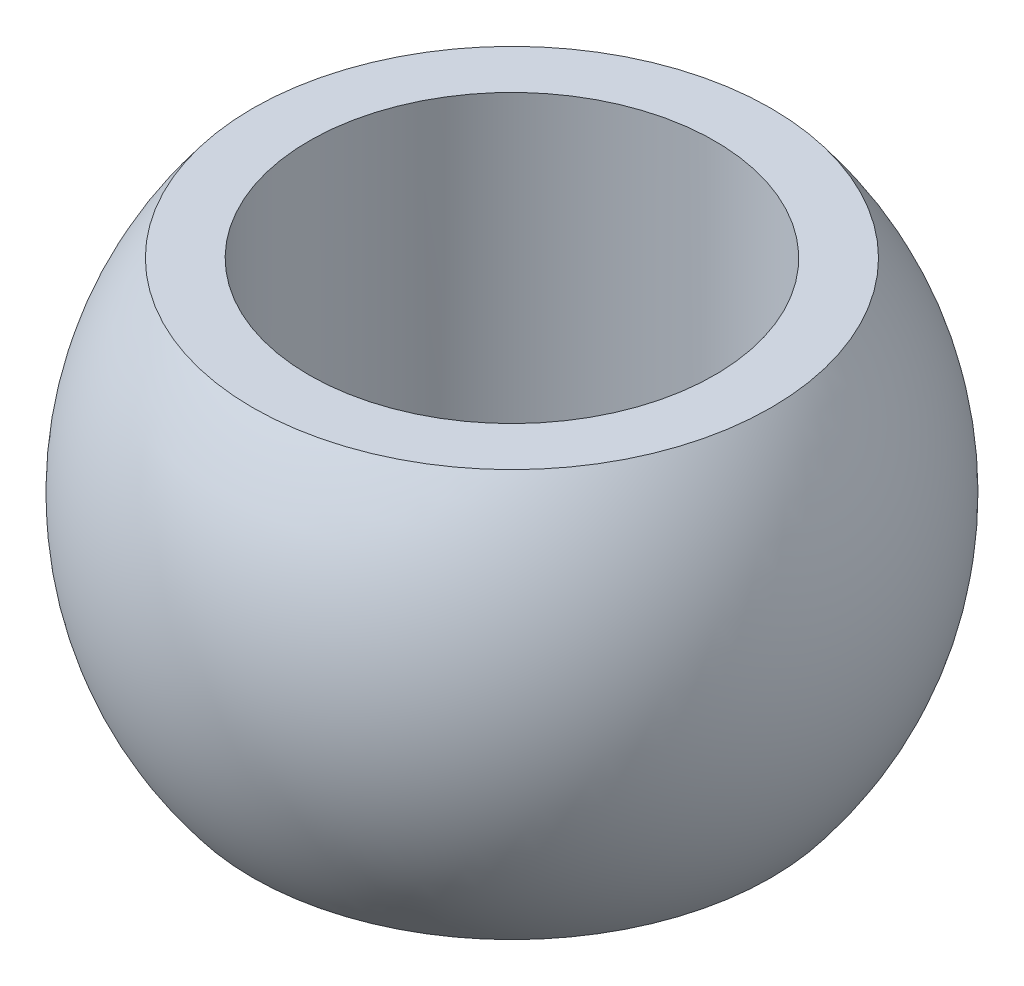
ISO-10303-21;
HEADER;
FILE_DESCRIPTION(('STEP AP214'),'2;1');
FILE_NAME('part.step','',(''),(''),'','','');
FILE_SCHEMA(('AUTOMOTIVE_DESIGN { 1 0 10303 214 1 1 1 1 }'));
ENDSEC;
DATA;
#1=APPLICATION_CONTEXT('core data for automotive mechanical design processes');
#2=APPLICATION_PROTOCOL_DEFINITION('international standard','automotive_design',2000,#1);
#3=PRODUCT_CONTEXT('',#1,'mechanical');
#4=PRODUCT('Part','Part','',(#3));
#5=PRODUCT_RELATED_PRODUCT_CATEGORY('part','',(#4));
#6=PRODUCT_DEFINITION_FORMATION('','',#4);
#7=PRODUCT_DEFINITION_CONTEXT('part definition',#1,'design');
#8=PRODUCT_DEFINITION('design','',#6,#7);
#9=PRODUCT_DEFINITION_SHAPE('','',#8);
#10=(LENGTH_UNIT() NAMED_UNIT(*) SI_UNIT(.MILLI.,.METRE.));
#11=(NAMED_UNIT(*) PLANE_ANGLE_UNIT() SI_UNIT($,.RADIAN.));
#12=(NAMED_UNIT(*) SI_UNIT($,.STERADIAN.) SOLID_ANGLE_UNIT());
#13=UNCERTAINTY_MEASURE_WITH_UNIT(LENGTH_MEASURE(1.E-05),#10,'distance_accuracy_value','');
#14=(GEOMETRIC_REPRESENTATION_CONTEXT(3) GLOBAL_UNCERTAINTY_ASSIGNED_CONTEXT((#13)) GLOBAL_UNIT_ASSIGNED_CONTEXT((#10,
#11,#12)) REPRESENTATION_CONTEXT('',''));
#15=CARTESIAN_POINT('',(0.,0.,0.));
#16=DIRECTION('',(0.,0.,1.));
#17=DIRECTION('',(1.,0.,0.));
#18=AXIS2_PLACEMENT_3D('',#15,#16,#17);
#19=CARTESIAN_POINT('',(0.,-9.5,0.));
#20=DIRECTION('',(0.,1.,0.));
#21=DIRECTION('',(0.,0.,1.));
#22=AXIS2_PLACEMENT_3D('',#19,#20,#21);
#23=CYLINDRICAL_SURFACE('',#22,4.);
#24=CARTESIAN_POINT('',(0.,-4.01392620570857,0.));
#25=DIRECTION('',(0.,-1.,0.));
#26=DIRECTION('',(0.,0.,-1.));
#27=AXIS2_PLACEMENT_3D('',#24,#25,#26);
#28=CIRCLE('',#27,4.);
#29=CARTESIAN_POINT('',(0.,-4.01392620570857,-4.));
#30=VERTEX_POINT('',#29);
#31=EDGE_CURVE('E48',#30,#30,#28,.F.);
#32=ORIENTED_EDGE('',*,*,#31,.F.);
#33=EDGE_LOOP('',(#32));
#34=FACE_BOUND('',#33,.T.);
#35=CARTESIAN_POINT('',(0.,4.01392620570857,0.));
#36=DIRECTION('',(0.,1.,0.));
#37=DIRECTION('',(0.,0.,1.));
#38=AXIS2_PLACEMENT_3D('',#35,#36,#37);
#39=CIRCLE('',#38,4.);
#40=CARTESIAN_POINT('',(0.,4.01392620570857,4.));
#41=VERTEX_POINT('',#40);
#42=EDGE_CURVE('E38',#41,#41,#39,.F.);
#43=ORIENTED_EDGE('',*,*,#42,.F.);
#44=EDGE_LOOP('',(#43));
#45=FACE_BOUND('',#44,.T.);
#46=ADVANCED_FACE('F34',(#34,#45),#23,.F.);
#47=CARTESIAN_POINT('',(8.44940630516735,-4.01392620570857,-9.5));
#48=DIRECTION('',(0.,-1.,0.));
#49=DIRECTION('',(0.,0.,-1.));
#50=AXIS2_PLACEMENT_3D('',#47,#48,#49);
#51=PLANE('',#50);
#52=CARTESIAN_POINT('',(0.,-4.01392620570857,0.));
#53=DIRECTION('',(0.,-1.,0.));
#54=DIRECTION('',(0.,0.,-1.));
#55=AXIS2_PLACEMENT_3D('',#52,#53,#54);
#56=CIRCLE('',#55,5.11257238727492);
#57=CARTESIAN_POINT('',(-5.11257238727492,-4.01392620570857,0.));
#58=VERTEX_POINT('',#57);
#59=EDGE_CURVE('E46',#58,#58,#56,.F.);
#60=ORIENTED_EDGE('',*,*,#59,.F.);
#61=EDGE_LOOP('',(#60));
#62=FACE_BOUND('',#61,.T.);
#63=ORIENTED_EDGE('',*,*,#31,.T.);
#64=EDGE_LOOP('',(#63));
#65=FACE_BOUND('',#64,.T.);
#66=ADVANCED_FACE('F56',(#62,#65),#51,.T.);
#67=CARTESIAN_POINT('',(8.44940630516735,4.01392620570857,-9.5));
#68=DIRECTION('',(0.,1.,0.));
#69=DIRECTION('',(0.,0.,1.));
#70=AXIS2_PLACEMENT_3D('',#67,#68,#69);
#71=PLANE('',#70);
#72=CARTESIAN_POINT('',(0.,4.01392620570857,0.));
#73=DIRECTION('',(0.,1.,0.));
#74=DIRECTION('',(0.,0.,1.));
#75=AXIS2_PLACEMENT_3D('',#72,#73,#74);
#76=CIRCLE('',#75,5.11257238727492);
#77=CARTESIAN_POINT('',(-5.11257238727492,4.01392620570857,0.));
#78=VERTEX_POINT('',#77);
#79=EDGE_CURVE('E11',#78,#78,#76,.F.);
#80=ORIENTED_EDGE('',*,*,#79,.F.);
#81=EDGE_LOOP('',(#80));
#82=FACE_BOUND('',#81,.T.);
#83=ORIENTED_EDGE('',*,*,#42,.T.);
#84=EDGE_LOOP('',(#83));
#85=FACE_BOUND('',#84,.T.);
#86=ADVANCED_FACE('F58',(#82,#85),#71,.T.);
#87=CARTESIAN_POINT('',(0.,0.,0.));
#88=DIRECTION('',(0.,-1.,0.));
#89=DIRECTION('',(-1.,0.,0.));
#90=AXIS2_PLACEMENT_3D('',#87,#88,#89);
#91=SPHERICAL_SURFACE('',#90,6.5);
#92=CARTESIAN_POINT('',(-5.11257238727492,-4.01392620570857,0.));
#93=CARTESIAN_POINT('',(-5.16823267661339,-3.94303310073965,0.));
#94=CARTESIAN_POINT('',(-5.22241653626789,-3.87098094434835,0.));
#95=CARTESIAN_POINT('',(-5.32774179460421,-3.72468618853274,0.));
#96=CARTESIAN_POINT('',(-5.37888319328604,-3.65044358910843,0.));
#97=CARTESIAN_POINT('',(-5.47803392807234,-3.49989560703851,0.));
#98=CARTESIAN_POINT('',(-5.5260432641768,-3.42359022439291,0.));
#99=CARTESIAN_POINT('',(-5.61884710213051,-3.26904892044303,0.));
#100=CARTESIAN_POINT('',(-5.66364160397976,-3.19081299913875,0.));
#101=CARTESIAN_POINT('',(-5.74993818635894,-3.03254593069745,0.));
#102=CARTESIAN_POINT('',(-5.79144026688888,-2.95251478356042,0.));
#103=CARTESIAN_POINT('',(-5.87108021766233,-2.79079575544262,0.));
#104=CARTESIAN_POINT('',(-5.90921808790585,-2.70910787446184,0.));
#105=CARTESIAN_POINT('',(-5.98206362304082,-2.54421671772787,0.));
#106=CARTESIAN_POINT('',(-6.01677128793227,-2.46101344197467,0.));
#107=CARTESIAN_POINT('',(-6.08269635979666,-2.29323546206483,0.));
#108=CARTESIAN_POINT('',(-6.1139137667696,-2.20866075790819,0.));
#109=CARTESIAN_POINT('',(-6.17280430741823,-2.0382862591178,0.));
#110=CARTESIAN_POINT('',(-6.20047744109392,-1.95248646448405,0.));
#111=CARTESIAN_POINT('',(-6.25223155288926,-1.77981024279559,0.));
#112=CARTESIAN_POINT('',(-6.27631253100892,-1.69293381574088,0.));
#113=CARTESIAN_POINT('',(-6.32084066474136,-1.51825465004534,0.));
#114=CARTESIAN_POINT('',(-6.34128782035415,-1.4304519114045,0.));
#115=CARTESIAN_POINT('',(-6.37851292970295,-1.25407204618028,0.));
#116=CARTESIAN_POINT('',(-6.39529088343897,-1.16549491959688,0.));
#117=CARTESIAN_POINT('',(-6.42514855841406,-0.987719542034626,0.));
#118=CARTESIAN_POINT('',(-6.43822827965315,-0.89852129105576,0.));
#119=CARTESIAN_POINT('',(-6.46066685800793,-0.719658002972923,0.));
#120=CARTESIAN_POINT('',(-6.47002571512363,-0.629992965868952,0.));
#121=CARTESIAN_POINT('',(-6.4850063717546,-0.45035125147813,0.));
#122=CARTESIAN_POINT('',(-6.49062817126987,-0.360374574191279,0.));
#123=CARTESIAN_POINT('',(-6.49812498539257,-0.180265264602952,0.));
#124=CARTESIAN_POINT('',(-6.5,-0.0901326323014758,0.));
#125=CARTESIAN_POINT('',(-6.5,0.0901326323014758,0.));
#126=CARTESIAN_POINT('',(-6.49812498539257,0.180265264602952,0.));
#127=CARTESIAN_POINT('',(-6.49062817126987,0.360374574191279,0.));
#128=CARTESIAN_POINT('',(-6.4850063717546,0.45035125147813,0.));
#129=CARTESIAN_POINT('',(-6.47002571512363,0.629992965868952,0.));
#130=CARTESIAN_POINT('',(-6.46066685800793,0.719658002972923,0.));
#131=CARTESIAN_POINT('',(-6.43822827965315,0.89852129105576,0.));
#132=CARTESIAN_POINT('',(-6.42514855841406,0.987719542034626,0.));
#133=CARTESIAN_POINT('',(-6.39529088343897,1.16549491959688,0.));
#134=CARTESIAN_POINT('',(-6.37851292970295,1.25407204618028,0.));
#135=CARTESIAN_POINT('',(-6.34128782035415,1.4304519114045,0.));
#136=CARTESIAN_POINT('',(-6.32084066474136,1.51825465004534,0.));
#137=CARTESIAN_POINT('',(-6.27631253100892,1.69293381574088,0.));
#138=CARTESIAN_POINT('',(-6.25223155288926,1.77981024279559,0.));
#139=CARTESIAN_POINT('',(-6.20047744109392,1.95248646448405,0.));
#140=CARTESIAN_POINT('',(-6.17280430741823,2.0382862591178,0.));
#141=CARTESIAN_POINT('',(-6.1139137667696,2.20866075790819,0.));
#142=CARTESIAN_POINT('',(-6.08269635979666,2.29323546206483,0.));
#143=CARTESIAN_POINT('',(-6.01677128793227,2.46101344197467,0.));
#144=CARTESIAN_POINT('',(-5.98206362304082,2.54421671772787,0.));
#145=CARTESIAN_POINT('',(-5.90921808790585,2.70910787446184,0.));
#146=CARTESIAN_POINT('',(-5.87108021766233,2.79079575544262,0.));
#147=CARTESIAN_POINT('',(-5.79144026688888,2.95251478356042,0.));
#148=CARTESIAN_POINT('',(-5.74993818635894,3.03254593069745,0.));
#149=CARTESIAN_POINT('',(-5.66364160397976,3.19081299913875,0.));
#150=CARTESIAN_POINT('',(-5.61884710213051,3.26904892044303,0.));
#151=CARTESIAN_POINT('',(-5.5260432641768,3.42359022439291,0.));
#152=CARTESIAN_POINT('',(-5.47803392807234,3.49989560703851,0.));
#153=CARTESIAN_POINT('',(-5.37888319328604,3.65044358910843,0.));
#154=CARTESIAN_POINT('',(-5.32774179460421,3.72468618853274,0.));
#155=CARTESIAN_POINT('',(-5.22241653626789,3.87098094434835,0.));
#156=CARTESIAN_POINT('',(-5.16823267661339,3.94303310073965,0.));
#157=CARTESIAN_POINT('',(-5.11257238727492,4.01392620570857,0.));
#158=B_SPLINE_CURVE_WITH_KNOTS('',3,(#92,#93,#94,#95,#96,#97,#98,#99,#100,#101,#102,#103,#104,
#105,#106,#107,#108,#109,#110,#111,#112,#113,#114,#115,#116,#117,#118,#119,#120,#121,#122,#123,
#124,#125,#126,#127,#128,#129,#130,#131,#132,#133,#134,#135,#136,#137,#138,#139,#140,#141,#142,
#143,#144,#145,#146,#147,#148,#149,#150,#151,#152,#153,#154,#155,#156,#157),.UNSPECIFIED.,.F.,
.F.,(4,2,2,2,2,2,2,2,2,2,2,2,2,2,2,2,2,2,2,2,2,2,2,2,2,2,2,2,2,2,2,2,4),(0.,0.270378404637145,
0.540756809274291,0.811135213911436,1.08151361854858,1.35189202318573,1.62227042782287,
1.89264883246002,2.16302723709716,2.43340564173431,2.70378404637145,2.9741624510086,
3.24454085564574,3.51491926028289,3.78529766492003,4.05567606955718,4.32605447419432,
4.59643287883147,4.86681128346861,5.13718968810576,5.4075680927429,5.67794649738005,
5.94832490201719,6.21870330665434,6.48908171129148,6.75946011592863,7.02983852056577,
7.30021692520292,7.57059532984006,7.84097373447721,8.11135213911435,8.3817305437515,
8.65210894838865),.UNSPECIFIED.);
#159=EDGE_CURVE('BSEAM36',#58,#78,#158,.T.);
#160=ORIENTED_EDGE('',*,*,#59,.T.);
#161=ORIENTED_EDGE('',*,*,#79,.T.);
#162=ORIENTED_EDGE('',*,*,#159,.T.);
#163=ORIENTED_EDGE('',*,*,#159,.F.);
#164=EDGE_LOOP('',(#160,#162,#161,#163));
#165=FACE_BOUND('',#164,.T.);
#166=ADVANCED_FACE('F36',(#165),#91,.T.);
#167=CLOSED_SHELL('',(#46,#66,#86,#166));
#168=MANIFOLD_SOLID_BREP('B2',#167);
#169=ADVANCED_BREP_SHAPE_REPRESENTATION('',(#18,#168),#14);
#170=SHAPE_DEFINITION_REPRESENTATION(#9,#169);
ENDSEC;
END-ISO-10303-21;
